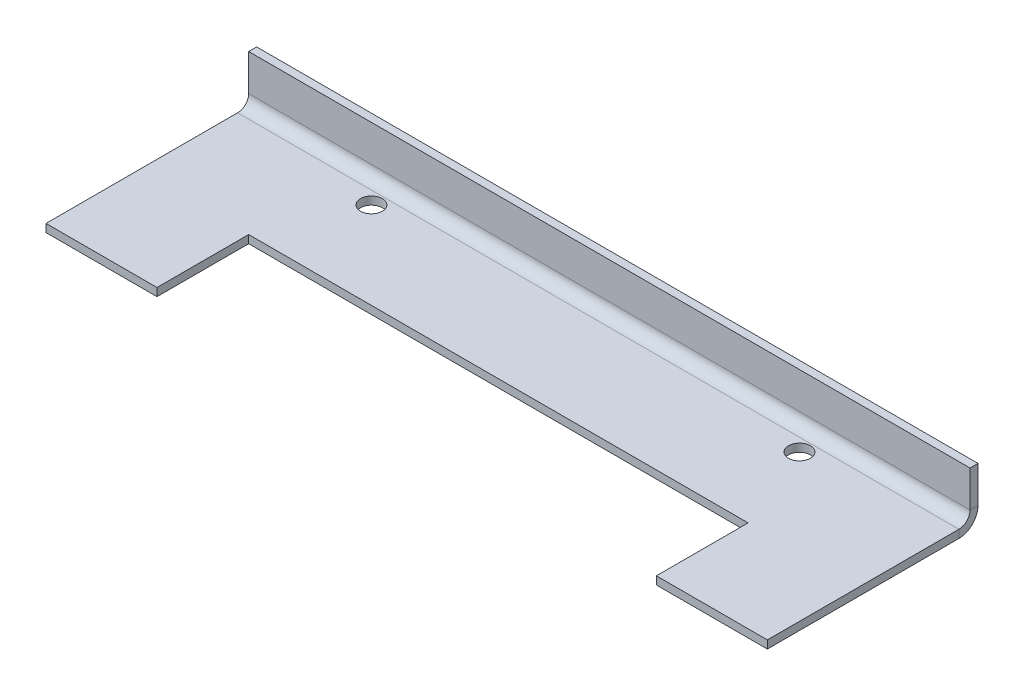
ISO-10303-21;
HEADER;
FILE_DESCRIPTION(('STEP AP214'),'2;1');
FILE_NAME('part.step','',(''),(''),'','','');
FILE_SCHEMA(('AUTOMOTIVE_DESIGN { 1 0 10303 214 1 1 1 1 }'));
ENDSEC;
DATA;
#1=APPLICATION_CONTEXT('core data for automotive mechanical design processes');
#2=APPLICATION_PROTOCOL_DEFINITION('international standard','automotive_design',2000,#1);
#3=PRODUCT_CONTEXT('',#1,'mechanical');
#4=PRODUCT('Part','Part','',(#3));
#5=PRODUCT_RELATED_PRODUCT_CATEGORY('part','',(#4));
#6=PRODUCT_DEFINITION_FORMATION('','',#4);
#7=PRODUCT_DEFINITION_CONTEXT('part definition',#1,'design');
#8=PRODUCT_DEFINITION('design','',#6,#7);
#9=PRODUCT_DEFINITION_SHAPE('','',#8);
#10=(LENGTH_UNIT() NAMED_UNIT(*) SI_UNIT(.MILLI.,.METRE.));
#11=(NAMED_UNIT(*) PLANE_ANGLE_UNIT() SI_UNIT($,.RADIAN.));
#12=(NAMED_UNIT(*) SI_UNIT($,.STERADIAN.) SOLID_ANGLE_UNIT());
#13=UNCERTAINTY_MEASURE_WITH_UNIT(LENGTH_MEASURE(1.E-05),#10,'distance_accuracy_value','');
#14=(GEOMETRIC_REPRESENTATION_CONTEXT(3) GLOBAL_UNCERTAINTY_ASSIGNED_CONTEXT((#13)) GLOBAL_UNIT_ASSIGNED_CONTEXT((#10,
#11,#12)) REPRESENTATION_CONTEXT('',''));
#15=CARTESIAN_POINT('',(0.,0.,0.));
#16=DIRECTION('',(0.,0.,1.));
#17=DIRECTION('',(1.,0.,0.));
#18=AXIS2_PLACEMENT_3D('',#15,#16,#17);
#19=CARTESIAN_POINT('',(0.,-0.91186,24.8246300000094));
#20=DIRECTION('',(-1.,0.,0.));
#21=DIRECTION('',(0.,0.,1.));
#22=AXIS2_PLACEMENT_3D('',#19,#20,#21);
#23=PLANE('',#22);
#24=DIRECTION('',(0.,0.,1.));
#25=VECTOR('',#24,1.);
#26=CARTESIAN_POINT('',(0.,0.,24.8246300000094));
#27=LINE('',#26,#25);
#28=CARTESIAN_POINT('',(0.,0.,26.0946300000094));
#29=VERTEX_POINT('',#28);
#30=CARTESIAN_POINT('',(0.,0.,48.0188174454437));
#31=VERTEX_POINT('',#30);
#32=EDGE_CURVE('E141',#29,#31,#27,.T.);
#33=ORIENTED_EDGE('',*,*,#32,.F.);
#34=DIRECTION('',(0.,-1.,0.));
#35=VECTOR('',#34,1.);
#36=CARTESIAN_POINT('',(0.,0.,26.0946300000094));
#37=LINE('',#36,#35);
#38=CARTESIAN_POINT('',(0.,-0.911860000000012,26.0946300000094));
#39=VERTEX_POINT('',#38);
#40=EDGE_CURVE('E192',#29,#39,#37,.T.);
#41=ORIENTED_EDGE('',*,*,#40,.T.);
#42=DIRECTION('',(0.,0.,1.));
#43=VECTOR('',#42,1.);
#44=CARTESIAN_POINT('',(0.,-0.91186,24.8246300000094));
#45=LINE('',#44,#43);
#46=CARTESIAN_POINT('',(0.,-0.91186,48.0188174454437));
#47=VERTEX_POINT('',#46);
#48=EDGE_CURVE('E95',#39,#47,#45,.T.);
#49=ORIENTED_EDGE('',*,*,#48,.T.);
#50=DIRECTION('',(0.,1.,0.));
#51=VECTOR('',#50,1.);
#52=CARTESIAN_POINT('',(0.,-0.91186,48.0188174454437));
#53=LINE('',#52,#51);
#54=EDGE_CURVE('E41',#47,#31,#53,.T.);
#55=ORIENTED_EDGE('',*,*,#54,.T.);
#56=EDGE_LOOP('',(#33,#41,#49,#55));
#57=FACE_BOUND('',#56,.T.);
#58=ADVANCED_FACE('F37',(#57),#23,.T.);
#59=CARTESIAN_POINT('',(0.,-0.91186,0.));
#60=DIRECTION('',(0.,-1.,0.));
#61=DIRECTION('',(0.,0.,-1.));
#62=AXIS2_PLACEMENT_3D('',#59,#60,#61);
#63=PLANE('',#62);
#64=CARTESIAN_POINT('',(65.76314,-0.91186,27.562130000009));
#65=DIRECTION('',(0.,-1.,0.));
#66=DIRECTION('',(0.,0.,-1.));
#67=AXIS2_PLACEMENT_3D('',#64,#65,#66);
#68=CIRCLE('',#67,1.25);
#69=CARTESIAN_POINT('',(65.76314,-0.91186,26.312130000009));
#70=VERTEX_POINT('',#69);
#71=EDGE_CURVE('E191',#70,#70,#68,.T.);
#72=ORIENTED_EDGE('',*,*,#71,.F.);
#73=EDGE_LOOP('',(#72));
#74=FACE_BOUND('',#73,.T.);
#75=CARTESIAN_POINT('',(16.78686,-0.91186,27.562130000009));
#76=DIRECTION('',(0.,-1.,0.));
#77=DIRECTION('',(0.,0.,-1.));
#78=AXIS2_PLACEMENT_3D('',#75,#76,#77);
#79=CIRCLE('',#78,1.25);
#80=CARTESIAN_POINT('',(16.78686,-0.91186,26.312130000009));
#81=VERTEX_POINT('',#80);
#82=EDGE_CURVE('E199',#81,#81,#79,.T.);
#83=ORIENTED_EDGE('',*,*,#82,.F.);
#84=EDGE_LOOP('',(#83));
#85=FACE_BOUND('',#84,.T.);
#86=ORIENTED_EDGE('',*,*,#48,.F.);
#87=DIRECTION('',(-1.,0.,0.));
#88=VECTOR('',#87,1.);
#89=CARTESIAN_POINT('',(0.,-0.911860000000012,26.0946300000094));
#90=LINE('',#89,#88);
#91=CARTESIAN_POINT('',(82.55,-0.91186,26.0946300000094));
#92=VERTEX_POINT('',#91);
#93=EDGE_CURVE('E470',#39,#92,#90,.F.);
#94=ORIENTED_EDGE('',*,*,#93,.T.);
#95=DIRECTION('',(0.,0.,-1.));
#96=VECTOR('',#95,1.);
#97=CARTESIAN_POINT('',(82.55,-0.91186,24.8246300000094));
#98=LINE('',#97,#96);
#99=CARTESIAN_POINT('',(82.55,-0.91186,48.0188174454437));
#100=VERTEX_POINT('',#99);
#101=EDGE_CURVE('E155',#100,#92,#98,.T.);
#102=ORIENTED_EDGE('',*,*,#101,.F.);
#103=DIRECTION('',(1.,0.,0.));
#104=VECTOR('',#103,1.);
#105=CARTESIAN_POINT('',(82.55,-0.91186,48.0188174454437));
#106=LINE('',#105,#104);
#107=CARTESIAN_POINT('',(69.85,-0.91186,48.0188174454437));
#108=VERTEX_POINT('',#107);
#109=EDGE_CURVE('E128',#108,#100,#106,.T.);
#110=ORIENTED_EDGE('',*,*,#109,.F.);
#111=DIRECTION('',(0.,0.,1.));
#112=VECTOR('',#111,1.);
#113=CARTESIAN_POINT('',(69.85,-0.91186,37.5246300000094));
#114=LINE('',#113,#112);
#115=CARTESIAN_POINT('',(69.85,-0.91186,37.5246300000094));
#116=VERTEX_POINT('',#115);
#117=EDGE_CURVE('E112',#116,#108,#114,.T.);
#118=ORIENTED_EDGE('',*,*,#117,.F.);
#119=DIRECTION('',(1.,0.,0.));
#120=VECTOR('',#119,1.);
#121=CARTESIAN_POINT('',(12.7,-0.91186,37.5246300000094));
#122=LINE('',#121,#120);
#123=CARTESIAN_POINT('',(12.7,-0.91186,37.5246300000094));
#124=VERTEX_POINT('',#123);
#125=EDGE_CURVE('E126',#124,#116,#122,.T.);
#126=ORIENTED_EDGE('',*,*,#125,.F.);
#127=DIRECTION('',(0.,0.,-1.));
#128=VECTOR('',#127,1.);
#129=CARTESIAN_POINT('',(12.7,-0.91186,37.5246300000094));
#130=LINE('',#129,#128);
#131=CARTESIAN_POINT('',(12.7,-0.91186,48.0188174454437));
#132=VERTEX_POINT('',#131);
#133=EDGE_CURVE('E131',#132,#124,#130,.T.);
#134=ORIENTED_EDGE('',*,*,#133,.F.);
#135=DIRECTION('',(1.,0.,0.));
#136=VECTOR('',#135,1.);
#137=CARTESIAN_POINT('',(0.,-0.91186,48.0188174454437));
#138=LINE('',#137,#136);
#139=EDGE_CURVE('E133',#47,#132,#138,.T.);
#140=ORIENTED_EDGE('',*,*,#139,.F.);
#141=EDGE_LOOP('',(#86,#94,#102,#110,#118,#126,#134,#140));
#142=FACE_BOUND('',#141,.T.);
#143=ADVANCED_FACE('F124',(#74,#85,#142),#63,.T.);
#144=CARTESIAN_POINT('',(0.,0.,0.));
#145=DIRECTION('',(0.,-1.,0.));
#146=DIRECTION('',(0.,0.,-1.));
#147=AXIS2_PLACEMENT_3D('',#144,#145,#146);
#148=PLANE('',#147);
#149=CARTESIAN_POINT('',(16.78686,0.,27.562130000009));
#150=DIRECTION('',(0.,-1.,0.));
#151=DIRECTION('',(0.,0.,-1.));
#152=AXIS2_PLACEMENT_3D('',#149,#150,#151);
#153=CIRCLE('',#152,1.25);
#154=CARTESIAN_POINT('',(16.78686,0.,26.312130000009));
#155=VERTEX_POINT('',#154);
#156=EDGE_CURVE('E142',#155,#155,#153,.T.);
#157=ORIENTED_EDGE('',*,*,#156,.T.);
#158=EDGE_LOOP('',(#157));
#159=FACE_BOUND('',#158,.T.);
#160=CARTESIAN_POINT('',(65.76314,0.,27.562130000009));
#161=DIRECTION('',(0.,-1.,0.));
#162=DIRECTION('',(0.,0.,-1.));
#163=AXIS2_PLACEMENT_3D('',#160,#161,#162);
#164=CIRCLE('',#163,1.25);
#165=CARTESIAN_POINT('',(65.76314,0.,26.312130000009));
#166=VERTEX_POINT('',#165);
#167=EDGE_CURVE('E196',#166,#166,#164,.T.);
#168=ORIENTED_EDGE('',*,*,#167,.T.);
#169=EDGE_LOOP('',(#168));
#170=FACE_BOUND('',#169,.T.);
#171=DIRECTION('',(-1.,0.,0.));
#172=VECTOR('',#171,1.);
#173=CARTESIAN_POINT('',(0.,0.,26.0946300000094));
#174=LINE('',#173,#172);
#175=CARTESIAN_POINT('',(82.55,0.,26.0946300000094));
#176=VERTEX_POINT('',#175);
#177=EDGE_CURVE('E171',#29,#176,#174,.F.);
#178=ORIENTED_EDGE('',*,*,#177,.F.);
#179=ORIENTED_EDGE('',*,*,#32,.T.);
#180=DIRECTION('',(1.,0.,0.));
#181=VECTOR('',#180,1.);
#182=CARTESIAN_POINT('',(0.,0.,48.0188174454437));
#183=LINE('',#182,#181);
#184=CARTESIAN_POINT('',(12.7,0.,48.0188174454437));
#185=VERTEX_POINT('',#184);
#186=EDGE_CURVE('E144',#31,#185,#183,.T.);
#187=ORIENTED_EDGE('',*,*,#186,.T.);
#188=DIRECTION('',(0.,0.,-1.));
#189=VECTOR('',#188,1.);
#190=CARTESIAN_POINT('',(12.7,0.,37.5246300000094));
#191=LINE('',#190,#189);
#192=CARTESIAN_POINT('',(12.7,0.,37.5246300000094));
#193=VERTEX_POINT('',#192);
#194=EDGE_CURVE('E147',#185,#193,#191,.T.);
#195=ORIENTED_EDGE('',*,*,#194,.T.);
#196=DIRECTION('',(1.,0.,0.));
#197=VECTOR('',#196,1.);
#198=CARTESIAN_POINT('',(12.7,0.,37.5246300000094));
#199=LINE('',#198,#197);
#200=CARTESIAN_POINT('',(69.85,0.,37.5246300000094));
#201=VERTEX_POINT('',#200);
#202=EDGE_CURVE('E150',#193,#201,#199,.T.);
#203=ORIENTED_EDGE('',*,*,#202,.T.);
#204=DIRECTION('',(0.,0.,1.));
#205=VECTOR('',#204,1.);
#206=CARTESIAN_POINT('',(69.85,0.,37.5246300000094));
#207=LINE('',#206,#205);
#208=CARTESIAN_POINT('',(69.85,0.,48.0188174454437));
#209=VERTEX_POINT('',#208);
#210=EDGE_CURVE('E115',#201,#209,#207,.T.);
#211=ORIENTED_EDGE('',*,*,#210,.T.);
#212=DIRECTION('',(1.,0.,0.));
#213=VECTOR('',#212,1.);
#214=CARTESIAN_POINT('',(82.55,0.,48.0188174454437));
#215=LINE('',#214,#213);
#216=CARTESIAN_POINT('',(82.55,0.,48.0188174454437));
#217=VERTEX_POINT('',#216);
#218=EDGE_CURVE('E153',#209,#217,#215,.T.);
#219=ORIENTED_EDGE('',*,*,#218,.T.);
#220=DIRECTION('',(0.,0.,-1.));
#221=VECTOR('',#220,1.);
#222=CARTESIAN_POINT('',(82.55,0.,24.8246300000094));
#223=LINE('',#222,#221);
#224=EDGE_CURVE('E138',#217,#176,#223,.T.);
#225=ORIENTED_EDGE('',*,*,#224,.T.);
#226=EDGE_LOOP('',(#178,#179,#187,#195,#203,#211,#219,#225));
#227=FACE_BOUND('',#226,.T.);
#228=ADVANCED_FACE('F169',(#159,#170,#227),#148,.F.);
#229=CARTESIAN_POINT('',(82.55,-0.91186,24.8246300000094));
#230=DIRECTION('',(1.,0.,0.));
#231=DIRECTION('',(0.,0.,-1.));
#232=AXIS2_PLACEMENT_3D('',#229,#230,#231);
#233=PLANE('',#232);
#234=DIRECTION('',(0.,-1.,0.));
#235=VECTOR('',#234,1.);
#236=CARTESIAN_POINT('',(82.55,0.,26.0946300000094));
#237=LINE('',#236,#235);
#238=EDGE_CURVE('E189',#176,#92,#237,.T.);
#239=ORIENTED_EDGE('',*,*,#238,.F.);
#240=ORIENTED_EDGE('',*,*,#224,.F.);
#241=DIRECTION('',(0.,1.,0.));
#242=VECTOR('',#241,1.);
#243=CARTESIAN_POINT('',(82.55,-0.91186,48.0188174454437));
#244=LINE('',#243,#242);
#245=EDGE_CURVE('E11',#100,#217,#244,.T.);
#246=ORIENTED_EDGE('',*,*,#245,.F.);
#247=ORIENTED_EDGE('',*,*,#101,.T.);
#248=EDGE_LOOP('',(#239,#240,#246,#247));
#249=FACE_BOUND('',#248,.T.);
#250=ADVANCED_FACE('F39',(#249),#233,.T.);
#251=CARTESIAN_POINT('',(82.55,-0.91186,48.0188174454437));
#252=DIRECTION('',(0.,0.,1.));
#253=DIRECTION('',(1.,0.,0.));
#254=AXIS2_PLACEMENT_3D('',#251,#252,#253);
#255=PLANE('',#254);
#256=ORIENTED_EDGE('',*,*,#218,.F.);
#257=DIRECTION('',(0.,1.,0.));
#258=VECTOR('',#257,1.);
#259=CARTESIAN_POINT('',(69.85,-0.91186,48.0188174454437));
#260=LINE('',#259,#258);
#261=EDGE_CURVE('E46',#108,#209,#260,.T.);
#262=ORIENTED_EDGE('',*,*,#261,.F.);
#263=ORIENTED_EDGE('',*,*,#109,.T.);
#264=ORIENTED_EDGE('',*,*,#245,.T.);
#265=EDGE_LOOP('',(#256,#262,#263,#264));
#266=FACE_BOUND('',#265,.T.);
#267=ADVANCED_FACE('F208',(#266),#255,.T.);
#268=CARTESIAN_POINT('',(69.85,-0.91186,37.5246300000094));
#269=DIRECTION('',(-1.,0.,0.));
#270=DIRECTION('',(0.,0.,1.));
#271=AXIS2_PLACEMENT_3D('',#268,#269,#270);
#272=PLANE('',#271);
#273=ORIENTED_EDGE('',*,*,#210,.F.);
#274=DIRECTION('',(0.,1.,0.));
#275=VECTOR('',#274,1.);
#276=CARTESIAN_POINT('',(69.85,-0.91186,37.5246300000094));
#277=LINE('',#276,#275);
#278=EDGE_CURVE('E109',#116,#201,#277,.T.);
#279=ORIENTED_EDGE('',*,*,#278,.F.);
#280=ORIENTED_EDGE('',*,*,#117,.T.);
#281=ORIENTED_EDGE('',*,*,#261,.T.);
#282=EDGE_LOOP('',(#273,#279,#280,#281));
#283=FACE_BOUND('',#282,.T.);
#284=ADVANCED_FACE('F111',(#283),#272,.T.);
#285=CARTESIAN_POINT('',(12.7,-0.91186,37.5246300000094));
#286=DIRECTION('',(0.,0.,1.));
#287=DIRECTION('',(1.,0.,0.));
#288=AXIS2_PLACEMENT_3D('',#285,#286,#287);
#289=PLANE('',#288);
#290=ORIENTED_EDGE('',*,*,#202,.F.);
#291=DIRECTION('',(0.,1.,0.));
#292=VECTOR('',#291,1.);
#293=CARTESIAN_POINT('',(12.7,-0.91186,37.5246300000094));
#294=LINE('',#293,#292);
#295=EDGE_CURVE('E120',#124,#193,#294,.T.);
#296=ORIENTED_EDGE('',*,*,#295,.F.);
#297=ORIENTED_EDGE('',*,*,#125,.T.);
#298=ORIENTED_EDGE('',*,*,#278,.T.);
#299=EDGE_LOOP('',(#290,#296,#297,#298));
#300=FACE_BOUND('',#299,.T.);
#301=ADVANCED_FACE('F130',(#300),#289,.T.);
#302=CARTESIAN_POINT('',(12.7,-0.91186,37.5246300000094));
#303=DIRECTION('',(1.,0.,0.));
#304=DIRECTION('',(0.,0.,-1.));
#305=AXIS2_PLACEMENT_3D('',#302,#303,#304);
#306=PLANE('',#305);
#307=ORIENTED_EDGE('',*,*,#194,.F.);
#308=DIRECTION('',(0.,1.,0.));
#309=VECTOR('',#308,1.);
#310=CARTESIAN_POINT('',(12.7,-0.91186,48.0188174454437));
#311=LINE('',#310,#309);
#312=EDGE_CURVE('E158',#132,#185,#311,.T.);
#313=ORIENTED_EDGE('',*,*,#312,.F.);
#314=ORIENTED_EDGE('',*,*,#133,.T.);
#315=ORIENTED_EDGE('',*,*,#295,.T.);
#316=EDGE_LOOP('',(#307,#313,#314,#315));
#317=FACE_BOUND('',#316,.T.);
#318=ADVANCED_FACE('F207',(#317),#306,.T.);
#319=CARTESIAN_POINT('',(0.,-0.91186,48.0188174454437));
#320=DIRECTION('',(0.,0.,1.));
#321=DIRECTION('',(1.,0.,0.));
#322=AXIS2_PLACEMENT_3D('',#319,#320,#321);
#323=PLANE('',#322);
#324=ORIENTED_EDGE('',*,*,#186,.F.);
#325=ORIENTED_EDGE('',*,*,#54,.F.);
#326=ORIENTED_EDGE('',*,*,#139,.T.);
#327=ORIENTED_EDGE('',*,*,#312,.T.);
#328=EDGE_LOOP('',(#324,#325,#326,#327));
#329=FACE_BOUND('',#328,.T.);
#330=ADVANCED_FACE('F166',(#329),#323,.T.);
#331=CARTESIAN_POINT('',(16.78686,-0.91186,27.562130000009));
#332=DIRECTION('',(0.,-1.,0.));
#333=DIRECTION('',(0.,0.,-1.));
#334=AXIS2_PLACEMENT_3D('',#331,#332,#333);
#335=CYLINDRICAL_SURFACE('',#334,1.25);
#336=ORIENTED_EDGE('',*,*,#156,.F.);
#337=EDGE_LOOP('',(#336));
#338=FACE_BOUND('',#337,.T.);
#339=ORIENTED_EDGE('',*,*,#82,.T.);
#340=EDGE_LOOP('',(#339));
#341=FACE_BOUND('',#340,.T.);
#342=ADVANCED_FACE('F226',(#338,#341),#335,.F.);
#343=CARTESIAN_POINT('',(65.76314,-0.91186,27.562130000009));
#344=DIRECTION('',(0.,-1.,0.));
#345=DIRECTION('',(0.,0.,-1.));
#346=AXIS2_PLACEMENT_3D('',#343,#344,#345);
#347=CYLINDRICAL_SURFACE('',#346,1.25);
#348=ORIENTED_EDGE('',*,*,#167,.F.);
#349=EDGE_LOOP('',(#348));
#350=FACE_BOUND('',#349,.T.);
#351=ORIENTED_EDGE('',*,*,#71,.T.);
#352=EDGE_LOOP('',(#351));
#353=FACE_BOUND('',#352,.T.);
#354=ADVANCED_FACE('F248',(#350,#353),#347,.F.);
#355=CARTESIAN_POINT('',(82.55,1.26999999999999,26.0946300000094));
#356=DIRECTION('',(1.,0.,0.));
#357=DIRECTION('',(0.,0.,-1.));
#358=AXIS2_PLACEMENT_3D('',#355,#356,#357);
#359=PLANE('',#358);
#360=DIRECTION('',(0.,0.,-1.));
#361=VECTOR('',#360,1.);
#362=CARTESIAN_POINT('',(82.55,1.27,24.8246300000094));
#363=LINE('',#362,#361);
#364=CARTESIAN_POINT('',(82.55,1.26999999999998,24.8246300000094));
#365=VERTEX_POINT('',#364);
#366=CARTESIAN_POINT('',(82.55,1.26999999999998,23.9127700000094));
#367=VERTEX_POINT('',#366);
#368=EDGE_CURVE('E492',#365,#367,#363,.T.);
#369=ORIENTED_EDGE('',*,*,#368,.F.);
#370=CARTESIAN_POINT('',(82.55,1.26999999999999,26.0946300000094));
#371=DIRECTION('',(-1.,0.,0.));
#372=DIRECTION('',(0.,0.,1.));
#373=AXIS2_PLACEMENT_3D('',#370,#371,#372);
#374=CIRCLE('',#373,1.27);
#375=EDGE_CURVE('E180',#176,#365,#374,.F.);
#376=ORIENTED_EDGE('',*,*,#375,.F.);
#377=ORIENTED_EDGE('',*,*,#238,.T.);
#378=CARTESIAN_POINT('',(82.55,1.26999999999999,26.0946300000094));
#379=DIRECTION('',(-1.,0.,0.));
#380=DIRECTION('',(0.,0.,1.));
#381=AXIS2_PLACEMENT_3D('',#378,#379,#380);
#382=CIRCLE('',#381,2.18186);
#383=EDGE_CURVE('E54',#92,#367,#382,.F.);
#384=ORIENTED_EDGE('',*,*,#383,.T.);
#385=EDGE_LOOP('',(#369,#376,#377,#384));
#386=FACE_BOUND('',#385,.T.);
#387=ADVANCED_FACE('F256',(#386),#359,.T.);
#388=CARTESIAN_POINT('',(0.,1.26999999999999,26.0946300000094));
#389=DIRECTION('',(1.,0.,0.));
#390=DIRECTION('',(0.,0.,-1.));
#391=AXIS2_PLACEMENT_3D('',#388,#389,#390);
#392=PLANE('',#391);
#393=CARTESIAN_POINT('',(0.,1.26999999999999,26.0946300000094));
#394=DIRECTION('',(-1.,0.,0.));
#395=DIRECTION('',(0.,0.,1.));
#396=AXIS2_PLACEMENT_3D('',#393,#394,#395);
#397=CIRCLE('',#396,1.27);
#398=CARTESIAN_POINT('',(0.,1.26999999999998,24.8246300000094));
#399=VERTEX_POINT('',#398);
#400=EDGE_CURVE('E181',#399,#29,#397,.T.);
#401=ORIENTED_EDGE('',*,*,#400,.F.);
#402=DIRECTION('',(0.,0.,-1.));
#403=VECTOR('',#402,1.);
#404=CARTESIAN_POINT('',(0.,1.27,24.8246300000094));
#405=LINE('',#404,#403);
#406=CARTESIAN_POINT('',(0.,1.27,23.9127700000094));
#407=VERTEX_POINT('',#406);
#408=EDGE_CURVE('E478',#399,#407,#405,.T.);
#409=ORIENTED_EDGE('',*,*,#408,.T.);
#410=CARTESIAN_POINT('',(0.,1.26999999999999,26.0946300000094));
#411=DIRECTION('',(-1.,0.,0.));
#412=DIRECTION('',(0.,0.,1.));
#413=AXIS2_PLACEMENT_3D('',#410,#411,#412);
#414=CIRCLE('',#413,2.18186);
#415=EDGE_CURVE('E183',#407,#39,#414,.T.);
#416=ORIENTED_EDGE('',*,*,#415,.T.);
#417=ORIENTED_EDGE('',*,*,#40,.F.);
#418=EDGE_LOOP('',(#401,#409,#416,#417));
#419=FACE_BOUND('',#418,.T.);
#420=ADVANCED_FACE('F264',(#419),#392,.F.);
#421=CARTESIAN_POINT('',(0.,1.26999999999999,26.0946300000094));
#422=DIRECTION('',(-1.,0.,0.));
#423=DIRECTION('',(0.,0.,-1.));
#424=AXIS2_PLACEMENT_3D('',#421,#422,#423);
#425=CYLINDRICAL_SURFACE('',#424,2.18186);
#426=ORIENTED_EDGE('',*,*,#93,.F.);
#427=ORIENTED_EDGE('',*,*,#415,.F.);
#428=DIRECTION('',(1.,0.,0.));
#429=VECTOR('',#428,1.);
#430=CARTESIAN_POINT('',(0.,1.27,23.9127700000094));
#431=LINE('',#430,#429);
#432=EDGE_CURVE('E482',#407,#367,#431,.T.);
#433=ORIENTED_EDGE('',*,*,#432,.T.);
#434=ORIENTED_EDGE('',*,*,#383,.F.);
#435=EDGE_LOOP('',(#426,#427,#433,#434));
#436=FACE_BOUND('',#435,.T.);
#437=ADVANCED_FACE('F273',(#436),#425,.T.);
#438=CARTESIAN_POINT('',(0.,1.26999999999999,26.0946300000094));
#439=DIRECTION('',(-1.,0.,0.));
#440=DIRECTION('',(0.,0.,-1.));
#441=AXIS2_PLACEMENT_3D('',#438,#439,#440);
#442=CYLINDRICAL_SURFACE('',#441,1.27);
#443=ORIENTED_EDGE('',*,*,#177,.T.);
#444=ORIENTED_EDGE('',*,*,#375,.T.);
#445=DIRECTION('',(-1.,0.,0.));
#446=VECTOR('',#445,1.);
#447=CARTESIAN_POINT('',(82.55,1.27,24.8246300000094));
#448=LINE('',#447,#446);
#449=EDGE_CURVE('E461',#365,#399,#448,.T.);
#450=ORIENTED_EDGE('',*,*,#449,.T.);
#451=ORIENTED_EDGE('',*,*,#400,.T.);
#452=EDGE_LOOP('',(#443,#444,#450,#451));
#453=FACE_BOUND('',#452,.T.);
#454=ADVANCED_FACE('F281',(#453),#442,.F.);
#455=CARTESIAN_POINT('',(0.,5.43814,23.9127700000094));
#456=DIRECTION('',(1.,0.,0.));
#457=DIRECTION('',(0.,0.,-1.));
#458=AXIS2_PLACEMENT_3D('',#455,#456,#457);
#459=PLANE('',#458);
#460=ORIENTED_EDGE('',*,*,#408,.F.);
#461=DIRECTION('',(0.,1.,0.));
#462=VECTOR('',#461,1.);
#463=CARTESIAN_POINT('',(0.,5.43814,24.8246300000094));
#464=LINE('',#463,#462);
#465=CARTESIAN_POINT('',(0.,5.43814,24.8246300000094));
#466=VERTEX_POINT('',#465);
#467=EDGE_CURVE('E451',#399,#466,#464,.T.);
#468=ORIENTED_EDGE('',*,*,#467,.T.);
#469=DIRECTION('',(0.,0.,1.));
#470=VECTOR('',#469,1.);
#471=CARTESIAN_POINT('',(0.,5.43814,23.9127700000094));
#472=LINE('',#471,#470);
#473=CARTESIAN_POINT('',(0.,5.43814,23.9127700000094));
#474=VERTEX_POINT('',#473);
#475=EDGE_CURVE('E185',#474,#466,#472,.T.);
#476=ORIENTED_EDGE('',*,*,#475,.F.);
#477=DIRECTION('',(0.,1.,0.));
#478=VECTOR('',#477,1.);
#479=CARTESIAN_POINT('',(0.,5.43814,23.9127700000094));
#480=LINE('',#479,#478);
#481=EDGE_CURVE('E462',#407,#474,#480,.T.);
#482=ORIENTED_EDGE('',*,*,#481,.F.);
#483=EDGE_LOOP('',(#460,#468,#476,#482));
#484=FACE_BOUND('',#483,.T.);
#485=ADVANCED_FACE('F288',(#484),#459,.F.);
#486=CARTESIAN_POINT('',(82.55,0.,23.9127700000094));
#487=DIRECTION('',(-1.,0.,0.));
#488=DIRECTION('',(0.,0.,1.));
#489=AXIS2_PLACEMENT_3D('',#486,#487,#488);
#490=PLANE('',#489);
#491=ORIENTED_EDGE('',*,*,#368,.T.);
#492=DIRECTION('',(0.,-1.,0.));
#493=VECTOR('',#492,1.);
#494=CARTESIAN_POINT('',(82.55,0.,23.9127700000094));
#495=LINE('',#494,#493);
#496=CARTESIAN_POINT('',(82.55,5.43814,23.9127700000094));
#497=VERTEX_POINT('',#496);
#498=EDGE_CURVE('E457',#497,#367,#495,.T.);
#499=ORIENTED_EDGE('',*,*,#498,.F.);
#500=DIRECTION('',(0.,0.,1.));
#501=VECTOR('',#500,1.);
#502=CARTESIAN_POINT('',(82.55,5.43814,23.9127700000094));
#503=LINE('',#502,#501);
#504=CARTESIAN_POINT('',(82.55,5.43814,24.8246300000094));
#505=VERTEX_POINT('',#504);
#506=EDGE_CURVE('E442',#497,#505,#503,.T.);
#507=ORIENTED_EDGE('',*,*,#506,.T.);
#508=DIRECTION('',(0.,-1.,0.));
#509=VECTOR('',#508,1.);
#510=CARTESIAN_POINT('',(82.55,0.,24.8246300000094));
#511=LINE('',#510,#509);
#512=EDGE_CURVE('E450',#505,#365,#511,.T.);
#513=ORIENTED_EDGE('',*,*,#512,.T.);
#514=EDGE_LOOP('',(#491,#499,#507,#513));
#515=FACE_BOUND('',#514,.T.);
#516=ADVANCED_FACE('F295',(#515),#490,.F.);
#517=CARTESIAN_POINT('',(0.,0.,23.9127700000094));
#518=DIRECTION('',(0.,0.,1.));
#519=DIRECTION('',(0.,-1.,0.));
#520=AXIS2_PLACEMENT_3D('',#517,#518,#519);
#521=PLANE('',#520);
#522=ORIENTED_EDGE('',*,*,#432,.F.);
#523=ORIENTED_EDGE('',*,*,#481,.T.);
#524=DIRECTION('',(1.,0.,0.));
#525=VECTOR('',#524,1.);
#526=CARTESIAN_POINT('',(82.55,5.43814,23.9127700000094));
#527=LINE('',#526,#525);
#528=EDGE_CURVE('E465',#474,#497,#527,.T.);
#529=ORIENTED_EDGE('',*,*,#528,.T.);
#530=ORIENTED_EDGE('',*,*,#498,.T.);
#531=EDGE_LOOP('',(#522,#523,#529,#530));
#532=FACE_BOUND('',#531,.T.);
#533=ADVANCED_FACE('F303',(#532),#521,.F.);
#534=CARTESIAN_POINT('',(0.,0.,24.8246300000094));
#535=DIRECTION('',(0.,0.,1.));
#536=DIRECTION('',(0.,-1.,0.));
#537=AXIS2_PLACEMENT_3D('',#534,#535,#536);
#538=PLANE('',#537);
#539=ORIENTED_EDGE('',*,*,#467,.F.);
#540=ORIENTED_EDGE('',*,*,#449,.F.);
#541=ORIENTED_EDGE('',*,*,#512,.F.);
#542=DIRECTION('',(1.,0.,0.));
#543=VECTOR('',#542,1.);
#544=CARTESIAN_POINT('',(82.55,5.43814,24.8246300000094));
#545=LINE('',#544,#543);
#546=EDGE_CURVE('E438',#466,#505,#545,.T.);
#547=ORIENTED_EDGE('',*,*,#546,.F.);
#548=EDGE_LOOP('',(#539,#540,#541,#547));
#549=FACE_BOUND('',#548,.T.);
#550=ADVANCED_FACE('F311',(#549),#538,.T.);
#551=CARTESIAN_POINT('',(82.55,5.43814,23.9127700000094));
#552=DIRECTION('',(0.,-1.,0.));
#553=DIRECTION('',(0.,0.,-1.));
#554=AXIS2_PLACEMENT_3D('',#551,#552,#553);
#555=PLANE('',#554);
#556=ORIENTED_EDGE('',*,*,#546,.T.);
#557=ORIENTED_EDGE('',*,*,#506,.F.);
#558=ORIENTED_EDGE('',*,*,#528,.F.);
#559=ORIENTED_EDGE('',*,*,#475,.T.);
#560=EDGE_LOOP('',(#556,#557,#558,#559));
#561=FACE_BOUND('',#560,.T.);
#562=ADVANCED_FACE('F319',(#561),#555,.F.);
#563=CLOSED_SHELL('',(#58,#143,#228,#250,#267,#284,#301,#318,#330,#342,#354,#387,#420,#437,#454,
#485,#516,#533,#550,#562));
#564=MANIFOLD_SOLID_BREP('B2',#563);
#565=ADVANCED_BREP_SHAPE_REPRESENTATION('',(#18,#564),#14);
#566=SHAPE_DEFINITION_REPRESENTATION(#9,#565);
ENDSEC;
END-ISO-10303-21;
